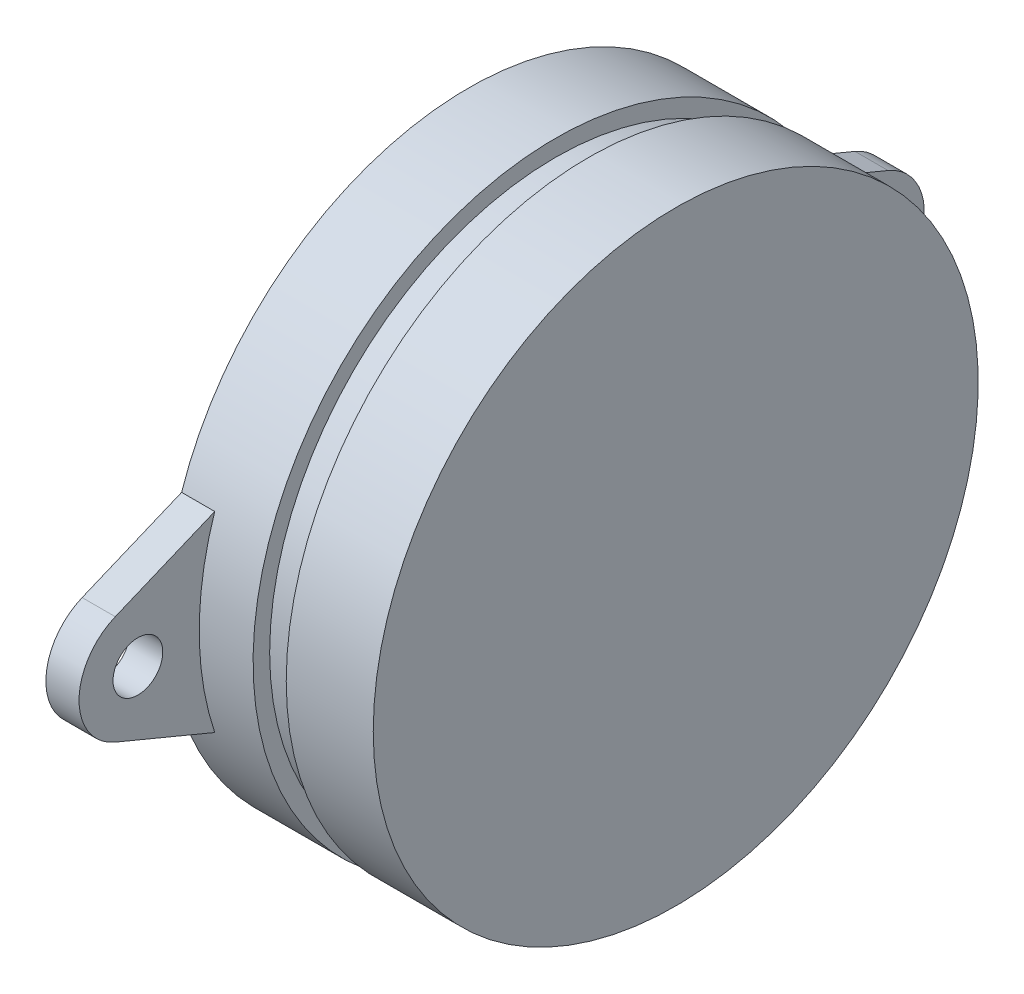
ISO-10303-21;
HEADER;
FILE_DESCRIPTION(('STEP AP214'),'2;1');
FILE_NAME('part.step','',(''),(''),'','','');
FILE_SCHEMA(('AUTOMOTIVE_DESIGN { 1 0 10303 214 1 1 1 1 }'));
ENDSEC;
DATA;
#1=APPLICATION_CONTEXT('core data for automotive mechanical design processes');
#2=APPLICATION_PROTOCOL_DEFINITION('international standard','automotive_design',2000,#1);
#3=PRODUCT_CONTEXT('',#1,'mechanical');
#4=PRODUCT('Part','Part','',(#3));
#5=PRODUCT_RELATED_PRODUCT_CATEGORY('part','',(#4));
#6=PRODUCT_DEFINITION_FORMATION('','',#4);
#7=PRODUCT_DEFINITION_CONTEXT('part definition',#1,'design');
#8=PRODUCT_DEFINITION('design','',#6,#7);
#9=PRODUCT_DEFINITION_SHAPE('','',#8);
#10=(LENGTH_UNIT() NAMED_UNIT(*) SI_UNIT(.MILLI.,.METRE.));
#11=(NAMED_UNIT(*) PLANE_ANGLE_UNIT() SI_UNIT($,.RADIAN.));
#12=(NAMED_UNIT(*) SI_UNIT($,.STERADIAN.) SOLID_ANGLE_UNIT());
#13=UNCERTAINTY_MEASURE_WITH_UNIT(LENGTH_MEASURE(1.E-05),#10,'distance_accuracy_value','');
#14=(GEOMETRIC_REPRESENTATION_CONTEXT(3) GLOBAL_UNCERTAINTY_ASSIGNED_CONTEXT((#13)) GLOBAL_UNIT_ASSIGNED_CONTEXT((#10,
#11,#12)) REPRESENTATION_CONTEXT('',''));
#15=CARTESIAN_POINT('',(0.,0.,0.));
#16=DIRECTION('',(0.,0.,1.));
#17=DIRECTION('',(1.,0.,0.));
#18=AXIS2_PLACEMENT_3D('',#15,#16,#17);
#19=CARTESIAN_POINT('',(5.25,0.,0.));
#20=DIRECTION('',(-1.,0.,0.));
#21=DIRECTION('',(0.,0.,1.));
#22=AXIS2_PLACEMENT_3D('',#19,#20,#21);
#23=CYLINDRICAL_SURFACE('',#22,18.25);
#24=CARTESIAN_POINT('',(5.25,0.,0.));
#25=DIRECTION('',(1.,0.,0.));
#26=DIRECTION('',(0.,0.,-1.));
#27=AXIS2_PLACEMENT_3D('',#24,#25,#26);
#28=CIRCLE('',#27,18.25);
#29=CARTESIAN_POINT('',(5.25,0.,-18.25));
#30=VERTEX_POINT('',#29);
#31=EDGE_CURVE('E234',#30,#30,#28,.T.);
#32=ORIENTED_EDGE('',*,*,#31,.F.);
#33=EDGE_LOOP('',(#32));
#34=FACE_BOUND('',#33,.T.);
#35=DIRECTION('',(-1.,0.,0.));
#36=VECTOR('',#35,1.);
#37=CARTESIAN_POINT('',(2.,5.77449333336406,-17.3123576309795));
#38=LINE('',#37,#36);
#39=CARTESIAN_POINT('',(2.,5.77449333336406,-17.3123576309795));
#40=VERTEX_POINT('',#39);
#41=CARTESIAN_POINT('',(0.,5.77449333336406,-17.3123576309795));
#42=VERTEX_POINT('',#41);
#43=EDGE_CURVE('E237',#40,#42,#38,.T.);
#44=ORIENTED_EDGE('',*,*,#43,.T.);
#45=CARTESIAN_POINT('',(0.,0.,0.));
#46=DIRECTION('',(1.,0.,0.));
#47=DIRECTION('',(0.,0.,-1.));
#48=AXIS2_PLACEMENT_3D('',#45,#46,#47);
#49=CIRCLE('',#48,18.25);
#50=CARTESIAN_POINT('',(0.,5.77449333336406,17.3123576309795));
#51=VERTEX_POINT('',#50);
#52=EDGE_CURVE('E239',#42,#51,#49,.T.);
#53=ORIENTED_EDGE('',*,*,#52,.T.);
#54=DIRECTION('',(-1.,0.,0.));
#55=VECTOR('',#54,1.);
#56=CARTESIAN_POINT('',(2.,5.77449333336406,17.3123576309795));
#57=LINE('',#56,#55);
#58=CARTESIAN_POINT('',(2.,5.77449333336406,17.3123576309795));
#59=VERTEX_POINT('',#58);
#60=EDGE_CURVE('E303',#59,#51,#57,.T.);
#61=ORIENTED_EDGE('',*,*,#60,.F.);
#62=CARTESIAN_POINT('',(2.,0.,0.));
#63=DIRECTION('',(-1.,0.,0.));
#64=DIRECTION('',(0.,0.,1.));
#65=AXIS2_PLACEMENT_3D('',#62,#63,#64);
#66=CIRCLE('',#65,18.25);
#67=CARTESIAN_POINT('',(2.,-5.77449333336406,17.3123576309795));
#68=VERTEX_POINT('',#67);
#69=EDGE_CURVE('E276',#68,#59,#66,.T.);
#70=ORIENTED_EDGE('',*,*,#69,.F.);
#71=DIRECTION('',(-1.,0.,0.));
#72=VECTOR('',#71,1.);
#73=CARTESIAN_POINT('',(2.,-5.77449333336406,17.3123576309795));
#74=LINE('',#73,#72);
#75=CARTESIAN_POINT('',(0.,-5.77449333336406,17.3123576309795));
#76=VERTEX_POINT('',#75);
#77=EDGE_CURVE('E300',#68,#76,#74,.T.);
#78=ORIENTED_EDGE('',*,*,#77,.T.);
#79=CARTESIAN_POINT('',(0.,-5.77449333336406,-17.3123576309795));
#80=VERTEX_POINT('',#79);
#81=EDGE_CURVE('E316',#76,#80,#49,.T.);
#82=ORIENTED_EDGE('',*,*,#81,.T.);
#83=DIRECTION('',(-1.,0.,0.));
#84=VECTOR('',#83,1.);
#85=CARTESIAN_POINT('',(2.,-5.77449333336406,-17.3123576309795));
#86=LINE('',#85,#84);
#87=CARTESIAN_POINT('',(2.,-5.77449333336406,-17.3123576309795));
#88=VERTEX_POINT('',#87);
#89=EDGE_CURVE('E58',#88,#80,#86,.T.);
#90=ORIENTED_EDGE('',*,*,#89,.F.);
#91=CARTESIAN_POINT('',(2.,0.,0.));
#92=DIRECTION('',(-1.,0.,0.));
#93=DIRECTION('',(0.,0.,1.));
#94=AXIS2_PLACEMENT_3D('',#91,#92,#93);
#95=CIRCLE('',#94,18.25);
#96=EDGE_CURVE('E241',#40,#88,#95,.T.);
#97=ORIENTED_EDGE('',*,*,#96,.F.);
#98=EDGE_LOOP('',(#44,#53,#61,#70,#78,#82,#90,#97));
#99=FACE_BOUND('',#98,.T.);
#100=ADVANCED_FACE('F34',(#34,#99),#23,.T.);
#101=CARTESIAN_POINT('',(5.25,0.,0.));
#102=DIRECTION('',(1.,0.,0.));
#103=DIRECTION('',(0.,0.,-1.));
#104=AXIS2_PLACEMENT_3D('',#101,#102,#103);
#105=PLANE('',#104);
#106=CARTESIAN_POINT('',(5.25,0.,0.));
#107=DIRECTION('',(1.,0.,0.));
#108=DIRECTION('',(0.,0.,-1.));
#109=AXIS2_PLACEMENT_3D('',#106,#107,#108);
#110=CIRCLE('',#109,17.25);
#111=CARTESIAN_POINT('',(5.25,0.,-17.25));
#112=VERTEX_POINT('',#111);
#113=EDGE_CURVE('E136',#112,#112,#110,.T.);
#114=ORIENTED_EDGE('',*,*,#113,.F.);
#115=EDGE_LOOP('',(#114));
#116=FACE_BOUND('',#115,.T.);
#117=ORIENTED_EDGE('',*,*,#31,.T.);
#118=EDGE_LOOP('',(#117));
#119=FACE_BOUND('',#118,.T.);
#120=ADVANCED_FACE('F222',(#116,#119),#105,.T.);
#121=CARTESIAN_POINT('',(0.,0.,0.));
#122=DIRECTION('',(1.,0.,0.));
#123=DIRECTION('',(0.,0.,-1.));
#124=AXIS2_PLACEMENT_3D('',#121,#122,#123);
#125=PLANE('',#124);
#126=CARTESIAN_POINT('',(0.,0.,0.));
#127=DIRECTION('',(-1.,0.,0.));
#128=DIRECTION('',(0.,0.,1.));
#129=AXIS2_PLACEMENT_3D('',#126,#127,#128);
#130=CIRCLE('',#129,8.);
#131=CARTESIAN_POINT('',(0.,0.,8.));
#132=VERTEX_POINT('',#131);
#133=EDGE_CURVE('E132',#132,#132,#130,.T.);
#134=ORIENTED_EDGE('',*,*,#133,.F.);
#135=EDGE_LOOP('',(#134));
#136=FACE_BOUND('',#135,.T.);
#137=ORIENTED_EDGE('',*,*,#81,.F.);
#138=DIRECTION('',(0.,-0.384131557483133,-0.92327836893625));
#139=VECTOR('',#138,1.);
#140=CARTESIAN_POINT('',(0.,-11.0624330645305,4.60254435238959));
#141=LINE('',#140,#139);
#142=CARTESIAN_POINT('',(0.,-3.27763820972369,23.3136670290651));
#143=VERTEX_POINT('',#142);
#144=EDGE_CURVE('E291',#143,#76,#141,.T.);
#145=ORIENTED_EDGE('',*,*,#144,.F.);
#146=CARTESIAN_POINT('',(0.,0.,21.95));
#147=DIRECTION('',(-1.,0.,0.));
#148=DIRECTION('',(0.,0.,1.));
#149=AXIS2_PLACEMENT_3D('',#146,#147,#148);
#150=CIRCLE('',#149,3.55);
#151=CARTESIAN_POINT('',(0.,3.27763820972369,23.3136670290651));
#152=VERTEX_POINT('',#151);
#153=EDGE_CURVE('E244',#152,#143,#150,.F.);
#154=ORIENTED_EDGE('',*,*,#153,.F.);
#155=DIRECTION('',(0.,0.384131557483133,-0.92327836893625));
#156=VECTOR('',#155,1.);
#157=CARTESIAN_POINT('',(0.,11.0624330645305,4.60254435238959));
#158=LINE('',#157,#156);
#159=EDGE_CURVE('E288',#152,#51,#158,.T.);
#160=ORIENTED_EDGE('',*,*,#159,.T.);
#161=ORIENTED_EDGE('',*,*,#52,.F.);
#162=DIRECTION('',(0.,0.384131557483133,0.92327836893625));
#163=VECTOR('',#162,1.);
#164=CARTESIAN_POINT('',(0.,11.0624330645305,-4.60254435238959));
#165=LINE('',#164,#163);
#166=CARTESIAN_POINT('',(0.,3.27763820972369,-23.3136670290651));
#167=VERTEX_POINT('',#166);
#168=EDGE_CURVE('E247',#167,#42,#165,.T.);
#169=ORIENTED_EDGE('',*,*,#168,.F.);
#170=CARTESIAN_POINT('',(0.,0.,-21.95));
#171=DIRECTION('',(-1.,0.,0.));
#172=DIRECTION('',(0.,0.,1.));
#173=AXIS2_PLACEMENT_3D('',#170,#171,#172);
#174=CIRCLE('',#173,3.55);
#175=CARTESIAN_POINT('',(0.,-3.27763820972369,-23.3136670290651));
#176=VERTEX_POINT('',#175);
#177=EDGE_CURVE('E252',#167,#176,#174,.T.);
#178=ORIENTED_EDGE('',*,*,#177,.T.);
#179=DIRECTION('',(0.,-0.384131557483133,0.92327836893625));
#180=VECTOR('',#179,1.);
#181=CARTESIAN_POINT('',(0.,-11.0624330645305,-4.60254435238959));
#182=LINE('',#181,#180);
#183=EDGE_CURVE('E255',#176,#80,#182,.T.);
#184=ORIENTED_EDGE('',*,*,#183,.T.);
#185=EDGE_LOOP('',(#137,#145,#154,#160,#161,#169,#178,#184));
#186=FACE_BOUND('',#185,.T.);
#187=CARTESIAN_POINT('',(0.,0.,21.95));
#188=DIRECTION('',(-1.,0.,0.));
#189=DIRECTION('',(0.,0.,1.));
#190=AXIS2_PLACEMENT_3D('',#187,#188,#189);
#191=CIRCLE('',#190,1.5);
#192=CARTESIAN_POINT('',(0.,0.,23.45));
#193=VERTEX_POINT('',#192);
#194=EDGE_CURVE('E273',#193,#193,#191,.T.);
#195=ORIENTED_EDGE('',*,*,#194,.F.);
#196=EDGE_LOOP('',(#195));
#197=FACE_BOUND('',#196,.T.);
#198=CARTESIAN_POINT('',(0.,0.,-21.95));
#199=DIRECTION('',(-1.,0.,0.));
#200=DIRECTION('',(0.,0.,1.));
#201=AXIS2_PLACEMENT_3D('',#198,#199,#200);
#202=CIRCLE('',#201,1.5);
#203=CARTESIAN_POINT('',(0.,0.,-20.45));
#204=VERTEX_POINT('',#203);
#205=EDGE_CURVE('E253',#204,#204,#202,.F.);
#206=ORIENTED_EDGE('',*,*,#205,.T.);
#207=EDGE_LOOP('',(#206));
#208=FACE_BOUND('',#207,.T.);
#209=ADVANCED_FACE('F220',(#136,#186,#197,#208),#125,.F.);
#210=CARTESIAN_POINT('',(7.25,0.,0.));
#211=DIRECTION('',(-1.,0.,0.));
#212=DIRECTION('',(0.,0.,1.));
#213=AXIS2_PLACEMENT_3D('',#210,#211,#212);
#214=CYLINDRICAL_SURFACE('',#213,17.25);
#215=CARTESIAN_POINT('',(7.25,0.,0.));
#216=DIRECTION('',(1.,0.,0.));
#217=DIRECTION('',(0.,0.,-1.));
#218=AXIS2_PLACEMENT_3D('',#215,#216,#217);
#219=CIRCLE('',#218,17.25);
#220=CARTESIAN_POINT('',(7.25,0.,-17.25));
#221=VERTEX_POINT('',#220);
#222=EDGE_CURVE('E309',#221,#221,#219,.T.);
#223=ORIENTED_EDGE('',*,*,#222,.F.);
#224=EDGE_LOOP('',(#223));
#225=FACE_BOUND('',#224,.T.);
#226=ORIENTED_EDGE('',*,*,#113,.T.);
#227=EDGE_LOOP('',(#226));
#228=FACE_BOUND('',#227,.T.);
#229=ADVANCED_FACE('F216',(#225,#228),#214,.T.);
#230=CARTESIAN_POINT('',(12.5,0.,0.));
#231=DIRECTION('',(-1.,0.,0.));
#232=DIRECTION('',(0.,0.,1.));
#233=AXIS2_PLACEMENT_3D('',#230,#231,#232);
#234=CYLINDRICAL_SURFACE('',#233,18.25);
#235=CARTESIAN_POINT('',(12.5,0.,0.));
#236=DIRECTION('',(1.,0.,0.));
#237=DIRECTION('',(0.,0.,-1.));
#238=AXIS2_PLACEMENT_3D('',#235,#236,#237);
#239=CIRCLE('',#238,18.25);
#240=CARTESIAN_POINT('',(12.5,0.,18.25));
#241=VERTEX_POINT('',#240);
#242=EDGE_CURVE('E306',#241,#241,#239,.T.);
#243=CARTESIAN_POINT('',(7.25,0.,0.));
#244=DIRECTION('',(1.,0.,0.));
#245=DIRECTION('',(0.,0.,-1.));
#246=AXIS2_PLACEMENT_3D('',#243,#244,#245);
#247=CIRCLE('',#246,18.25);
#248=CARTESIAN_POINT('',(7.25,0.,18.25));
#249=VERTEX_POINT('',#248);
#250=EDGE_CURVE('E299',#249,#249,#247,.T.);
#251=CARTESIAN_POINT('',(12.5,0.,18.25));
#252=CARTESIAN_POINT('',(12.4453125,0.,18.25));
#253=CARTESIAN_POINT('',(12.390625,0.,18.25));
#254=CARTESIAN_POINT('',(12.28125,0.,18.25));
#255=CARTESIAN_POINT('',(12.2265625,0.,18.25));
#256=CARTESIAN_POINT('',(12.1171875,0.,18.25));
#257=CARTESIAN_POINT('',(12.0625,0.,18.25));
#258=CARTESIAN_POINT('',(11.953125,0.,18.25));
#259=CARTESIAN_POINT('',(11.8984375,0.,18.25));
#260=CARTESIAN_POINT('',(11.7890625,0.,18.25));
#261=CARTESIAN_POINT('',(11.734375,0.,18.25));
#262=CARTESIAN_POINT('',(11.625,0.,18.25));
#263=CARTESIAN_POINT('',(11.5703125,0.,18.25));
#264=CARTESIAN_POINT('',(11.4609375,0.,18.25));
#265=CARTESIAN_POINT('',(11.40625,0.,18.25));
#266=CARTESIAN_POINT('',(11.296875,0.,18.25));
#267=CARTESIAN_POINT('',(11.2421875,0.,18.25));
#268=CARTESIAN_POINT('',(11.1328125,0.,18.25));
#269=CARTESIAN_POINT('',(11.078125,0.,18.25));
#270=CARTESIAN_POINT('',(10.96875,0.,18.25));
#271=CARTESIAN_POINT('',(10.9140625,0.,18.25));
#272=CARTESIAN_POINT('',(10.8046875,0.,18.25));
#273=CARTESIAN_POINT('',(10.75,0.,18.25));
#274=CARTESIAN_POINT('',(10.640625,0.,18.25));
#275=CARTESIAN_POINT('',(10.5859375,0.,18.25));
#276=CARTESIAN_POINT('',(10.4765625,0.,18.25));
#277=CARTESIAN_POINT('',(10.421875,0.,18.25));
#278=CARTESIAN_POINT('',(10.3125,0.,18.25));
#279=CARTESIAN_POINT('',(10.2578125,0.,18.25));
#280=CARTESIAN_POINT('',(10.1484375,0.,18.25));
#281=CARTESIAN_POINT('',(10.09375,0.,18.25));
#282=CARTESIAN_POINT('',(9.984375,0.,18.25));
#283=CARTESIAN_POINT('',(9.9296875,0.,18.25));
#284=CARTESIAN_POINT('',(9.8203125,0.,18.25));
#285=CARTESIAN_POINT('',(9.765625,0.,18.25));
#286=CARTESIAN_POINT('',(9.65625,0.,18.25));
#287=CARTESIAN_POINT('',(9.6015625,0.,18.25));
#288=CARTESIAN_POINT('',(9.4921875,0.,18.25));
#289=CARTESIAN_POINT('',(9.4375,0.,18.25));
#290=CARTESIAN_POINT('',(9.328125,0.,18.25));
#291=CARTESIAN_POINT('',(9.2734375,0.,18.25));
#292=CARTESIAN_POINT('',(9.1640625,0.,18.25));
#293=CARTESIAN_POINT('',(9.109375,0.,18.25));
#294=CARTESIAN_POINT('',(9.,0.,18.25));
#295=CARTESIAN_POINT('',(8.9453125,0.,18.25));
#296=CARTESIAN_POINT('',(8.8359375,0.,18.25));
#297=CARTESIAN_POINT('',(8.78125,0.,18.25));
#298=CARTESIAN_POINT('',(8.671875,0.,18.25));
#299=CARTESIAN_POINT('',(8.6171875,0.,18.25));
#300=CARTESIAN_POINT('',(8.5078125,0.,18.25));
#301=CARTESIAN_POINT('',(8.453125,0.,18.25));
#302=CARTESIAN_POINT('',(8.34375,0.,18.25));
#303=CARTESIAN_POINT('',(8.2890625,0.,18.25));
#304=CARTESIAN_POINT('',(8.1796875,0.,18.25));
#305=CARTESIAN_POINT('',(8.125,0.,18.25));
#306=CARTESIAN_POINT('',(8.015625,0.,18.25));
#307=CARTESIAN_POINT('',(7.9609375,0.,18.25));
#308=CARTESIAN_POINT('',(7.8515625,0.,18.25));
#309=CARTESIAN_POINT('',(7.796875,0.,18.25));
#310=CARTESIAN_POINT('',(7.6875,0.,18.25));
#311=CARTESIAN_POINT('',(7.6328125,0.,18.25));
#312=CARTESIAN_POINT('',(7.5234375,0.,18.25));
#313=CARTESIAN_POINT('',(7.46875,0.,18.25));
#314=CARTESIAN_POINT('',(7.359375,0.,18.25));
#315=CARTESIAN_POINT('',(7.3046875,0.,18.25));
#316=CARTESIAN_POINT('',(7.25,0.,18.25));
#317=B_SPLINE_CURVE_WITH_KNOTS('',3,(#251,#252,#253,#254,#255,#256,#257,#258,#259,#260,#261,
#262,#263,#264,#265,#266,#267,#268,#269,#270,#271,#272,#273,#274,#275,#276,#277,#278,#279,#280,
#281,#282,#283,#284,#285,#286,#287,#288,#289,#290,#291,#292,#293,#294,#295,#296,#297,#298,#299,
#300,#301,#302,#303,#304,#305,#306,#307,#308,#309,#310,#311,#312,#313,#314,#315,#316),
.UNSPECIFIED.,.F.,.F.,(4,2,2,2,2,2,2,2,2,2,2,2,2,2,2,2,2,2,2,2,2,2,2,2,2,2,2,2,2,2,2,2,4),(0.,
0.164062499999999,0.328124999999999,0.4921875,0.656249999999999,0.8203125,0.984374999999999,
1.1484375,1.3125,1.4765625,1.640625,1.8046875,1.96875,2.1328125,2.296875,2.4609375,2.625,
2.7890625,2.953125,3.1171875,3.28125,3.4453125,3.609375,3.7734375,3.9375,4.1015625,4.265625,
4.4296875,4.59375,4.7578125,4.921875,5.0859375,5.25),.UNSPECIFIED.);
#318=EDGE_CURVE('BSEAM209',#241,#249,#317,.T.);
#319=ORIENTED_EDGE('',*,*,#242,.F.);
#320=ORIENTED_EDGE('',*,*,#250,.T.);
#321=ORIENTED_EDGE('',*,*,#318,.T.);
#322=ORIENTED_EDGE('',*,*,#318,.F.);
#323=EDGE_LOOP('',(#319,#321,#320,#322));
#324=FACE_BOUND('',#323,.T.);
#325=ADVANCED_FACE('F209',(#324),#234,.T.);
#326=CARTESIAN_POINT('',(12.5,0.,0.));
#327=DIRECTION('',(1.,0.,0.));
#328=DIRECTION('',(0.,0.,-1.));
#329=AXIS2_PLACEMENT_3D('',#326,#327,#328);
#330=PLANE('',#329);
#331=ORIENTED_EDGE('',*,*,#242,.T.);
#332=EDGE_LOOP('',(#331));
#333=FACE_BOUND('',#332,.T.);
#334=ADVANCED_FACE('F206',(#333),#330,.T.);
#335=CARTESIAN_POINT('',(7.25,0.,0.));
#336=DIRECTION('',(1.,0.,0.));
#337=DIRECTION('',(0.,0.,-1.));
#338=AXIS2_PLACEMENT_3D('',#335,#336,#337);
#339=PLANE('',#338);
#340=ORIENTED_EDGE('',*,*,#222,.T.);
#341=EDGE_LOOP('',(#340));
#342=FACE_BOUND('',#341,.T.);
#343=ORIENTED_EDGE('',*,*,#250,.F.);
#344=EDGE_LOOP('',(#343));
#345=FACE_BOUND('',#344,.T.);
#346=ADVANCED_FACE('F204',(#342,#345),#339,.F.);
#347=CARTESIAN_POINT('',(2.,0.,21.95));
#348=DIRECTION('',(-1.,0.,0.));
#349=DIRECTION('',(0.,0.,1.));
#350=AXIS2_PLACEMENT_3D('',#347,#348,#349);
#351=CYLINDRICAL_SURFACE('',#350,3.55);
#352=ORIENTED_EDGE('',*,*,#153,.T.);
#353=DIRECTION('',(-1.,0.,0.));
#354=VECTOR('',#353,1.);
#355=CARTESIAN_POINT('',(2.,-3.27763820972369,23.3136670290651));
#356=LINE('',#355,#354);
#357=CARTESIAN_POINT('',(2.,-3.27763820972369,23.3136670290651));
#358=VERTEX_POINT('',#357);
#359=EDGE_CURVE('E296',#358,#143,#356,.T.);
#360=ORIENTED_EDGE('',*,*,#359,.F.);
#361=CARTESIAN_POINT('',(2.,0.,21.95));
#362=DIRECTION('',(-1.,0.,0.));
#363=DIRECTION('',(0.,0.,1.));
#364=AXIS2_PLACEMENT_3D('',#361,#362,#363);
#365=CIRCLE('',#364,3.55);
#366=CARTESIAN_POINT('',(2.,3.27763820972369,23.3136670290651));
#367=VERTEX_POINT('',#366);
#368=EDGE_CURVE('E269',#367,#358,#365,.F.);
#369=ORIENTED_EDGE('',*,*,#368,.F.);
#370=DIRECTION('',(-1.,0.,0.));
#371=VECTOR('',#370,1.);
#372=CARTESIAN_POINT('',(2.,3.27763820972369,23.3136670290651));
#373=LINE('',#372,#371);
#374=EDGE_CURVE('E285',#367,#152,#373,.T.);
#375=ORIENTED_EDGE('',*,*,#374,.T.);
#376=EDGE_LOOP('',(#352,#360,#369,#375));
#377=FACE_BOUND('',#376,.T.);
#378=ADVANCED_FACE('F197',(#377),#351,.T.);
#379=CARTESIAN_POINT('',(2.,-11.0624330645305,4.60254435238959));
#380=DIRECTION('',(0.,0.92327836893625,-0.384131557483133));
#381=DIRECTION('',(0.,0.384131557483133,0.92327836893625));
#382=AXIS2_PLACEMENT_3D('',#379,#380,#381);
#383=PLANE('',#382);
#384=ORIENTED_EDGE('',*,*,#144,.T.);
#385=ORIENTED_EDGE('',*,*,#77,.F.);
#386=DIRECTION('',(0.,-0.384131557483133,-0.92327836893625));
#387=VECTOR('',#386,1.);
#388=CARTESIAN_POINT('',(2.,-11.0624330645305,4.60254435238959));
#389=LINE('',#388,#387);
#390=EDGE_CURVE('E279',#358,#68,#389,.T.);
#391=ORIENTED_EDGE('',*,*,#390,.F.);
#392=ORIENTED_EDGE('',*,*,#359,.T.);
#393=EDGE_LOOP('',(#384,#385,#391,#392));
#394=FACE_BOUND('',#393,.T.);
#395=ADVANCED_FACE('F194',(#394),#383,.F.);
#396=CARTESIAN_POINT('',(2.,11.0624330645305,4.60254435238959));
#397=DIRECTION('',(0.,0.92327836893625,0.384131557483133));
#398=DIRECTION('',(0.,-0.384131557483133,0.92327836893625));
#399=AXIS2_PLACEMENT_3D('',#396,#397,#398);
#400=PLANE('',#399);
#401=ORIENTED_EDGE('',*,*,#159,.F.);
#402=ORIENTED_EDGE('',*,*,#374,.F.);
#403=DIRECTION('',(0.,0.384131557483133,-0.92327836893625));
#404=VECTOR('',#403,1.);
#405=CARTESIAN_POINT('',(2.,11.0624330645305,4.60254435238959));
#406=LINE('',#405,#404);
#407=EDGE_CURVE('E272',#367,#59,#406,.T.);
#408=ORIENTED_EDGE('',*,*,#407,.T.);
#409=ORIENTED_EDGE('',*,*,#60,.T.);
#410=EDGE_LOOP('',(#401,#402,#408,#409));
#411=FACE_BOUND('',#410,.T.);
#412=ADVANCED_FACE('F192',(#411),#400,.T.);
#413=CARTESIAN_POINT('',(2.,0.,21.95));
#414=DIRECTION('',(-1.,0.,0.));
#415=DIRECTION('',(0.,0.,1.));
#416=AXIS2_PLACEMENT_3D('',#413,#414,#415);
#417=CYLINDRICAL_SURFACE('',#416,1.5);
#418=CARTESIAN_POINT('',(2.,0.,21.95));
#419=DIRECTION('',(-1.,0.,0.));
#420=DIRECTION('',(0.,0.,1.));
#421=AXIS2_PLACEMENT_3D('',#418,#419,#420);
#422=CIRCLE('',#421,1.5);
#423=CARTESIAN_POINT('',(2.,0.,23.45));
#424=VERTEX_POINT('',#423);
#425=EDGE_CURVE('E282',#424,#424,#422,.T.);
#426=ORIENTED_EDGE('',*,*,#425,.F.);
#427=EDGE_LOOP('',(#426));
#428=FACE_BOUND('',#427,.T.);
#429=ORIENTED_EDGE('',*,*,#194,.T.);
#430=EDGE_LOOP('',(#429));
#431=FACE_BOUND('',#430,.T.);
#432=ADVANCED_FACE('F188',(#428,#431),#417,.F.);
#433=CARTESIAN_POINT('',(2.,0.,0.));
#434=DIRECTION('',(-1.,0.,0.));
#435=DIRECTION('',(0.,0.,1.));
#436=AXIS2_PLACEMENT_3D('',#433,#434,#435);
#437=PLANE('',#436);
#438=ORIENTED_EDGE('',*,*,#368,.T.);
#439=ORIENTED_EDGE('',*,*,#390,.T.);
#440=ORIENTED_EDGE('',*,*,#69,.T.);
#441=ORIENTED_EDGE('',*,*,#407,.F.);
#442=EDGE_LOOP('',(#438,#439,#440,#441));
#443=FACE_BOUND('',#442,.T.);
#444=ORIENTED_EDGE('',*,*,#425,.T.);
#445=EDGE_LOOP('',(#444));
#446=FACE_BOUND('',#445,.T.);
#447=ADVANCED_FACE('F181',(#443,#446),#437,.F.);
#448=CARTESIAN_POINT('',(2.,11.0624330645305,-4.60254435238959));
#449=DIRECTION('',(0.,-0.92327836893625,0.384131557483133));
#450=DIRECTION('',(0.,-0.384131557483133,-0.92327836893625));
#451=AXIS2_PLACEMENT_3D('',#448,#449,#450);
#452=PLANE('',#451);
#453=ORIENTED_EDGE('',*,*,#168,.T.);
#454=ORIENTED_EDGE('',*,*,#43,.F.);
#455=DIRECTION('',(0.,0.384131557483133,0.92327836893625));
#456=VECTOR('',#455,1.);
#457=CARTESIAN_POINT('',(2.,11.0624330645305,-4.60254435238959));
#458=LINE('',#457,#456);
#459=CARTESIAN_POINT('',(2.,3.27763820972369,-23.3136670290651));
#460=VERTEX_POINT('',#459);
#461=EDGE_CURVE('E328',#460,#40,#458,.T.);
#462=ORIENTED_EDGE('',*,*,#461,.F.);
#463=DIRECTION('',(-1.,0.,0.));
#464=VECTOR('',#463,1.);
#465=CARTESIAN_POINT('',(2.,3.27763820972369,-23.3136670290651));
#466=LINE('',#465,#464);
#467=EDGE_CURVE('E248',#460,#167,#466,.T.);
#468=ORIENTED_EDGE('',*,*,#467,.T.);
#469=EDGE_LOOP('',(#453,#454,#462,#468));
#470=FACE_BOUND('',#469,.T.);
#471=ADVANCED_FACE('F174',(#470),#452,.F.);
#472=CARTESIAN_POINT('',(2.,-11.0624330645305,-4.60254435238959));
#473=DIRECTION('',(0.,-0.92327836893625,-0.384131557483133));
#474=DIRECTION('',(0.,0.384131557483133,-0.92327836893625));
#475=AXIS2_PLACEMENT_3D('',#472,#473,#474);
#476=PLANE('',#475);
#477=ORIENTED_EDGE('',*,*,#183,.F.);
#478=DIRECTION('',(-1.,0.,0.));
#479=VECTOR('',#478,1.);
#480=CARTESIAN_POINT('',(2.,-3.27763820972369,-23.3136670290651));
#481=LINE('',#480,#479);
#482=CARTESIAN_POINT('',(2.,-3.27763820972369,-23.3136670290651));
#483=VERTEX_POINT('',#482);
#484=EDGE_CURVE('E266',#483,#176,#481,.T.);
#485=ORIENTED_EDGE('',*,*,#484,.F.);
#486=DIRECTION('',(0.,-0.384131557483133,0.92327836893625));
#487=VECTOR('',#486,1.);
#488=CARTESIAN_POINT('',(2.,-11.0624330645305,-4.60254435238959));
#489=LINE('',#488,#487);
#490=EDGE_CURVE('E321',#483,#88,#489,.T.);
#491=ORIENTED_EDGE('',*,*,#490,.T.);
#492=ORIENTED_EDGE('',*,*,#89,.T.);
#493=EDGE_LOOP('',(#477,#485,#491,#492));
#494=FACE_BOUND('',#493,.T.);
#495=ADVANCED_FACE('F170',(#494),#476,.T.);
#496=CARTESIAN_POINT('',(2.,0.,-21.95));
#497=DIRECTION('',(-1.,0.,0.));
#498=DIRECTION('',(0.,0.,1.));
#499=AXIS2_PLACEMENT_3D('',#496,#497,#498);
#500=CYLINDRICAL_SURFACE('',#499,1.5);
#501=CARTESIAN_POINT('',(2.,0.,-21.95));
#502=DIRECTION('',(-1.,0.,0.));
#503=DIRECTION('',(0.,0.,1.));
#504=AXIS2_PLACEMENT_3D('',#501,#502,#503);
#505=CIRCLE('',#504,1.5);
#506=CARTESIAN_POINT('',(2.,0.,-20.45));
#507=VERTEX_POINT('',#506);
#508=EDGE_CURVE('E263',#507,#507,#505,.F.);
#509=ORIENTED_EDGE('',*,*,#508,.T.);
#510=EDGE_LOOP('',(#509));
#511=FACE_BOUND('',#510,.T.);
#512=ORIENTED_EDGE('',*,*,#205,.F.);
#513=EDGE_LOOP('',(#512));
#514=FACE_BOUND('',#513,.T.);
#515=ADVANCED_FACE('F173',(#511,#514),#500,.F.);
#516=CARTESIAN_POINT('',(2.,0.,-21.95));
#517=DIRECTION('',(-1.,0.,0.));
#518=DIRECTION('',(0.,0.,1.));
#519=AXIS2_PLACEMENT_3D('',#516,#517,#518);
#520=CYLINDRICAL_SURFACE('',#519,3.55);
#521=ORIENTED_EDGE('',*,*,#177,.F.);
#522=ORIENTED_EDGE('',*,*,#467,.F.);
#523=CARTESIAN_POINT('',(2.,0.,-21.95));
#524=DIRECTION('',(-1.,0.,0.));
#525=DIRECTION('',(0.,0.,1.));
#526=AXIS2_PLACEMENT_3D('',#523,#524,#525);
#527=CIRCLE('',#526,3.55);
#528=EDGE_CURVE('E325',#460,#483,#527,.T.);
#529=ORIENTED_EDGE('',*,*,#528,.T.);
#530=ORIENTED_EDGE('',*,*,#484,.T.);
#531=EDGE_LOOP('',(#521,#522,#529,#530));
#532=FACE_BOUND('',#531,.T.);
#533=ADVANCED_FACE('F168',(#532),#520,.T.);
#534=CARTESIAN_POINT('',(2.,0.,0.));
#535=DIRECTION('',(-1.,0.,0.));
#536=DIRECTION('',(0.,0.,1.));
#537=AXIS2_PLACEMENT_3D('',#534,#535,#536);
#538=PLANE('',#537);
#539=ORIENTED_EDGE('',*,*,#508,.F.);
#540=EDGE_LOOP('',(#539));
#541=FACE_BOUND('',#540,.T.);
#542=ORIENTED_EDGE('',*,*,#461,.T.);
#543=ORIENTED_EDGE('',*,*,#96,.T.);
#544=ORIENTED_EDGE('',*,*,#490,.F.);
#545=ORIENTED_EDGE('',*,*,#528,.F.);
#546=EDGE_LOOP('',(#542,#543,#544,#545));
#547=FACE_BOUND('',#546,.T.);
#548=ADVANCED_FACE('F164',(#541,#547),#538,.F.);
#549=CARTESIAN_POINT('',(-2.,0.,0.));
#550=DIRECTION('',(1.,0.,0.));
#551=DIRECTION('',(0.,0.,-1.));
#552=AXIS2_PLACEMENT_3D('',#549,#550,#551);
#553=CYLINDRICAL_SURFACE('',#552,8.);
#554=CARTESIAN_POINT('',(-2.,0.,0.));
#555=DIRECTION('',(-1.,0.,0.));
#556=DIRECTION('',(0.,0.,1.));
#557=AXIS2_PLACEMENT_3D('',#554,#555,#556);
#558=CIRCLE('',#557,8.);
#559=CARTESIAN_POINT('',(-2.,0.,8.));
#560=VERTEX_POINT('',#559);
#561=EDGE_CURVE('E258',#560,#560,#558,.T.);
#562=ORIENTED_EDGE('',*,*,#561,.F.);
#563=EDGE_LOOP('',(#562));
#564=FACE_BOUND('',#563,.T.);
#565=ORIENTED_EDGE('',*,*,#133,.T.);
#566=EDGE_LOOP('',(#565));
#567=FACE_BOUND('',#566,.T.);
#568=ADVANCED_FACE('F160',(#564,#567),#553,.T.);
#569=CARTESIAN_POINT('',(-2.,0.,0.));
#570=DIRECTION('',(-1.,0.,0.));
#571=DIRECTION('',(0.,0.,1.));
#572=AXIS2_PLACEMENT_3D('',#569,#570,#571);
#573=PLANE('',#572);
#574=CARTESIAN_POINT('',(-2.,0.,0.));
#575=DIRECTION('',(-1.,0.,0.));
#576=DIRECTION('',(0.,0.,1.));
#577=AXIS2_PLACEMENT_3D('',#574,#575,#576);
#578=CIRCLE('',#577,2.5);
#579=CARTESIAN_POINT('',(-2.,0.,2.5));
#580=VERTEX_POINT('',#579);
#581=EDGE_CURVE('E139',#580,#580,#578,.F.);
#582=ORIENTED_EDGE('',*,*,#581,.T.);
#583=EDGE_LOOP('',(#582));
#584=FACE_BOUND('',#583,.T.);
#585=ORIENTED_EDGE('',*,*,#561,.T.);
#586=EDGE_LOOP('',(#585));
#587=FACE_BOUND('',#586,.T.);
#588=ADVANCED_FACE('F156',(#584,#587),#573,.T.);
#589=CARTESIAN_POINT('',(-10.5,0.,0.));
#590=DIRECTION('',(1.,0.,0.));
#591=DIRECTION('',(0.,0.,-1.));
#592=AXIS2_PLACEMENT_3D('',#589,#590,#591);
#593=CYLINDRICAL_SURFACE('',#592,2.5);
#594=CARTESIAN_POINT('',(-10.25,0.,0.));
#595=DIRECTION('',(-1.,0.,0.));
#596=DIRECTION('',(0.,0.,1.));
#597=AXIS2_PLACEMENT_3D('',#594,#595,#596);
#598=CIRCLE('',#597,2.5);
#599=CARTESIAN_POINT('',(-10.25,2.,1.5));
#600=VERTEX_POINT('',#599);
#601=CARTESIAN_POINT('',(-10.25,2.,-1.5));
#602=VERTEX_POINT('',#601);
#603=EDGE_CURVE('E131',#600,#602,#598,.F.);
#604=ORIENTED_EDGE('',*,*,#603,.T.);
#605=DIRECTION('',(1.,0.,0.));
#606=VECTOR('',#605,1.);
#607=CARTESIAN_POINT('',(-10.5,2.,-1.5));
#608=LINE('',#607,#606);
#609=CARTESIAN_POINT('',(-5.5,2.,-1.5));
#610=VERTEX_POINT('',#609);
#611=EDGE_CURVE('E119',#602,#610,#608,.T.);
#612=ORIENTED_EDGE('',*,*,#611,.T.);
#613=CARTESIAN_POINT('',(-5.5,0.,0.));
#614=DIRECTION('',(1.,0.,0.));
#615=DIRECTION('',(0.,0.,-1.));
#616=AXIS2_PLACEMENT_3D('',#613,#614,#615);
#617=CIRCLE('',#616,2.5);
#618=CARTESIAN_POINT('',(-5.5,2.,1.5));
#619=VERTEX_POINT('',#618);
#620=EDGE_CURVE('E11',#610,#619,#617,.T.);
#621=ORIENTED_EDGE('',*,*,#620,.T.);
#622=DIRECTION('',(1.,0.,0.));
#623=VECTOR('',#622,1.);
#624=CARTESIAN_POINT('',(-10.5,2.,1.5));
#625=LINE('',#624,#623);
#626=EDGE_CURVE('E337',#619,#600,#625,.F.);
#627=ORIENTED_EDGE('',*,*,#626,.T.);
#628=EDGE_LOOP('',(#604,#612,#621,#627));
#629=FACE_BOUND('',#628,.T.);
#630=ORIENTED_EDGE('',*,*,#581,.F.);
#631=EDGE_LOOP('',(#630));
#632=FACE_BOUND('',#631,.T.);
#633=ADVANCED_FACE('F153',(#629,#632),#593,.T.);
#634=CARTESIAN_POINT('',(-10.5,0.,0.));
#635=DIRECTION('',(-1.,0.,0.));
#636=DIRECTION('',(0.,0.,1.));
#637=AXIS2_PLACEMENT_3D('',#634,#635,#636);
#638=PLANE('',#637);
#639=DIRECTION('',(0.,0.,1.));
#640=VECTOR('',#639,1.);
#641=CARTESIAN_POINT('',(-10.5,2.,-2.5));
#642=LINE('',#641,#640);
#643=CARTESIAN_POINT('',(-10.5,2.,-1.03077640640451));
#644=VERTEX_POINT('',#643);
#645=CARTESIAN_POINT('',(-10.5,2.,1.03077640640451));
#646=VERTEX_POINT('',#645);
#647=EDGE_CURVE('E50',#644,#646,#642,.T.);
#648=ORIENTED_EDGE('',*,*,#647,.F.);
#649=CARTESIAN_POINT('',(-10.5,0.,0.));
#650=DIRECTION('',(-1.,0.,0.));
#651=DIRECTION('',(0.,0.,1.));
#652=AXIS2_PLACEMENT_3D('',#649,#650,#651);
#653=CIRCLE('',#652,2.25000000000004);
#654=EDGE_CURVE('E128',#644,#646,#653,.T.);
#655=ORIENTED_EDGE('',*,*,#654,.T.);
#656=EDGE_LOOP('',(#648,#655));
#657=FACE_BOUND('',#656,.T.);
#658=ADVANCED_FACE('F127',(#657),#638,.T.);
#659=CARTESIAN_POINT('',(-10.5,0.,0.));
#660=DIRECTION('',(1.,0.,0.));
#661=DIRECTION('',(0.,0.,-1.));
#662=AXIS2_PLACEMENT_3D('',#659,#660,#661);
#663=CONICAL_SURFACE('',#662,2.25000000000004,0.785398163397445);
#664=CARTESIAN_POINT('',(-7.24605234082493,2.,-5.12771292438832));
#665=CARTESIAN_POINT('',(-7.39195620364307,2.,-4.97105779822472));
#666=CARTESIAN_POINT('',(-7.53743361320405,2.,-4.81399958383105));
#667=CARTESIAN_POINT('',(-7.82716761791949,2.,-4.49869649808192));
#668=CARTESIAN_POINT('',(-7.97142392935752,2.,-4.34045136623269));
#669=CARTESIAN_POINT('',(-8.25923743640635,2.,-4.02140480545241));
#670=CARTESIAN_POINT('',(-8.40278356327603,2.,-3.86059336824064));
#671=CARTESIAN_POINT('',(-8.68750952996003,2.,-3.53691771771962));
#672=CARTESIAN_POINT('',(-8.82868967059135,2.,-3.37405377005583));
#673=CARTESIAN_POINT('',(-9.07971637301703,2.,-3.0782795904921));
#674=CARTESIAN_POINT('',(-9.19018071289902,2.,-2.94589559791911));
#675=CARTESIAN_POINT('',(-9.4080444600176,2.,-2.67855955538986));
#676=CARTESIAN_POINT('',(-9.51544300803696,2.,-2.54360680283889));
#677=CARTESIAN_POINT('',(-9.72558380083054,2.,-2.2704086994873));
#678=CARTESIAN_POINT('',(-9.8283329824435,2.,-2.13216875721169));
#679=CARTESIAN_POINT('',(-9.97721233283318,2.,-1.92114649317543));
#680=CARTESIAN_POINT('',(-10.0259551283863,2.,-1.85021046732202));
#681=CARTESIAN_POINT('',(-10.1212155744514,2.,-1.70686438183812));
#682=CARTESIAN_POINT('',(-10.1677335131123,2.,-1.63445451483094));
#683=CARTESIAN_POINT('',(-10.2537569285196,2.,-1.49464895285938));
#684=CARTESIAN_POINT('',(-10.2935131629985,2.,-1.42740834994838));
#685=CARTESIAN_POINT('',(-10.3700453279497,2.,-1.2912616318106));
#686=CARTESIAN_POINT('',(-10.4068219214887,2.,-1.22235589158632));
#687=CARTESIAN_POINT('',(-10.4765763459607,2.,-1.08264119302503));
#688=CARTESIAN_POINT('',(-10.5095550958814,2.,-1.01183270024512));
#689=CARTESIAN_POINT('',(-10.570664915147,2.,-0.868181965810504));
#690=CARTESIAN_POINT('',(-10.5987972201309,2.,-0.795340248062302));
#691=CARTESIAN_POINT('',(-10.6635217407715,2.,-0.604485421966115));
#692=CARTESIAN_POINT('',(-10.695542889521,2.,-0.484799820216861));
#693=CARTESIAN_POINT('',(-10.7280988146376,2.,-0.302753381854745));
#694=CARTESIAN_POINT('',(-10.7363706899496,2.,-0.24173795828367));
#695=CARTESIAN_POINT('',(-10.7473781930704,2.,-0.119195603544146));
#696=CARTESIAN_POINT('',(-10.7501141798236,2.,-0.0576687057992132));
#697=CARTESIAN_POINT('',(-10.7498780105695,2.,0.0655765776820028));
#698=CARTESIAN_POINT('',(-10.7468868268542,2.,0.12729491921711));
#699=CARTESIAN_POINT('',(-10.7353394018658,2.,0.250204852287976));
#700=CARTESIAN_POINT('',(-10.7267827343109,2.,0.311396403111012));
#701=CARTESIAN_POINT('',(-10.7045363919317,2.,0.43302559555427));
#702=CARTESIAN_POINT('',(-10.690830592519,2.,0.493460246093505));
#703=CARTESIAN_POINT('',(-10.6589271414852,2.,0.613115945128668));
#704=CARTESIAN_POINT('',(-10.6407292276771,2.,0.672336922568706));
#705=CARTESIAN_POINT('',(-10.5767420892979,2.,0.858780003029383));
#706=CARTESIAN_POINT('',(-10.5237856829447,2.,0.983542413480154));
#707=CARTESIAN_POINT('',(-10.4058946675636,2.,1.22729947821647));
#708=CARTESIAN_POINT('',(-10.340936354321,2.,1.34628211943671));
#709=CARTESIAN_POINT('',(-10.2023027701779,2.,1.58108516527598));
#710=CARTESIAN_POINT('',(-10.1285251173546,2.,1.69684431765153));
#711=CARTESIAN_POINT('',(-9.97565789796318,2.,1.92459751963661));
#712=CARTESIAN_POINT('',(-9.89657316530606,2.,2.0365948597808));
#713=CARTESIAN_POINT('',(-9.71559784311689,2.,2.28392033089664));
#714=CARTESIAN_POINT('',(-9.61272537544249,2.,2.41852567525524));
#715=CARTESIAN_POINT('',(-9.40317939526606,2.,2.6847566947347));
#716=CARTESIAN_POINT('',(-9.29650519925492,2.,2.81638182701856));
#717=CARTESIAN_POINT('',(-9.08039049879208,2.,3.0775654823437));
#718=CARTESIAN_POINT('',(-8.97094721504341,2.,3.20712169744004));
#719=CARTESIAN_POINT('',(-8.75013163352664,2.,3.46458080502194));
#720=CARTESIAN_POINT('',(-8.63875928022998,2.,3.59248364972929));
#721=CARTESIAN_POINT('',(-8.42171558136291,2.,3.83890922967755));
#722=CARTESIAN_POINT('',(-8.31613310610283,2.,3.9575103981636));
#723=CARTESIAN_POINT('',(-8.10397993528268,2.,4.19382980953111));
#724=CARTESIAN_POINT('',(-7.99740921540805,2.,4.31154803055914));
#725=CARTESIAN_POINT('',(-7.78372873600608,2.,4.54600690884746));
#726=CARTESIAN_POINT('',(-7.67662073848104,2.,4.6627491739051));
#727=CARTESIAN_POINT('',(-7.46177477996164,2.,4.89564229315672));
#728=CARTESIAN_POINT('',(-7.35403684989817,2.,5.0117931758734));
#729=CARTESIAN_POINT('',(-7.24605234082493,2.,5.12771292438832));
#730=B_SPLINE_CURVE_WITH_KNOTS('',3,(#664,#665,#666,#667,#668,#669,#670,#671,#672,#673,#674,
#675,#676,#677,#678,#679,#680,#681,#682,#683,#684,#685,#686,#687,#688,#689,#690,#691,#692,#693,
#694,#695,#696,#697,#698,#699,#700,#701,#702,#703,#704,#705,#706,#707,#708,#709,#710,#711,#712,
#713,#714,#715,#716,#717,#718,#719,#720,#721,#722,#723,#724,#725,#726,#727,#728,#729),
.UNSPECIFIED.,.F.,.F.,(4,2,2,2,2,2,2,2,2,2,2,2,2,2,2,2,2,2,2,2,2,2,2,2,2,2,2,2,2,2,2,2,4),(0.,
0.642235390419121,1.2846161167042,1.93127854273116,2.57785811709901,3.09507724414104,
3.61243993125055,4.129003387134,4.38717784084488,4.64531876645764,4.87960181083624,
5.11383257562959,5.34800654253242,5.58212071630835,5.95215764732894,6.13666481679491,
6.32116002251705,6.50626925103405,6.69139265944867,6.87710068346238,7.06281954908422,
7.46831055847874,7.87461115886473,8.28619594657114,8.69741080472403,9.20554759392983,
9.71377620606797,10.2225369154249,10.7313122939532,11.2076720873038,11.6840436321708,
12.1593388330723,12.6346108888452),.UNSPECIFIED.);
#731=EDGE_CURVE('E43',#602,#644,#730,.T.);
#732=ORIENTED_EDGE('',*,*,#731,.F.);
#733=ORIENTED_EDGE('',*,*,#603,.F.);
#734=EDGE_CURVE('E124',#646,#600,#730,.T.);
#735=ORIENTED_EDGE('',*,*,#734,.F.);
#736=ORIENTED_EDGE('',*,*,#654,.F.);
#737=EDGE_LOOP('',(#732,#733,#735,#736));
#738=FACE_BOUND('',#737,.T.);
#739=ADVANCED_FACE('F36',(#738),#663,.T.);
#740=CARTESIAN_POINT('',(-5.5,0.,0.));
#741=DIRECTION('',(1.,0.,0.));
#742=DIRECTION('',(0.,0.,-1.));
#743=AXIS2_PLACEMENT_3D('',#740,#741,#742);
#744=PLANE('',#743);
#745=DIRECTION('',(0.,0.,1.));
#746=VECTOR('',#745,1.);
#747=CARTESIAN_POINT('',(-5.5,2.,-2.5));
#748=LINE('',#747,#746);
#749=EDGE_CURVE('E129',#610,#619,#748,.T.);
#750=ORIENTED_EDGE('',*,*,#749,.T.);
#751=ORIENTED_EDGE('',*,*,#620,.F.);
#752=EDGE_LOOP('',(#750,#751));
#753=FACE_BOUND('',#752,.T.);
#754=ADVANCED_FACE('F150',(#753),#744,.F.);
#755=CARTESIAN_POINT('',(-5.5,2.,-2.5));
#756=DIRECTION('',(0.,-1.,0.));
#757=DIRECTION('',(0.,0.,-1.));
#758=AXIS2_PLACEMENT_3D('',#755,#756,#757);
#759=PLANE('',#758);
#760=ORIENTED_EDGE('',*,*,#731,.T.);
#761=ORIENTED_EDGE('',*,*,#647,.T.);
#762=ORIENTED_EDGE('',*,*,#734,.T.);
#763=ORIENTED_EDGE('',*,*,#626,.F.);
#764=ORIENTED_EDGE('',*,*,#749,.F.);
#765=ORIENTED_EDGE('',*,*,#611,.F.);
#766=EDGE_LOOP('',(#760,#761,#762,#763,#764,#765));
#767=FACE_BOUND('',#766,.T.);
#768=ADVANCED_FACE('F116',(#767),#759,.F.);
#769=CLOSED_SHELL('',(#100,#120,#209,#229,#325,#334,#346,#378,#395,#412,#432,#447,#471,#495,
#515,#533,#548,#568,#588,#633,#658,#739,#754,#768));
#770=MANIFOLD_SOLID_BREP('B2',#769);
#771=ADVANCED_BREP_SHAPE_REPRESENTATION('',(#18,#770),#14);
#772=SHAPE_DEFINITION_REPRESENTATION(#9,#771);
ENDSEC;
END-ISO-10303-21;
